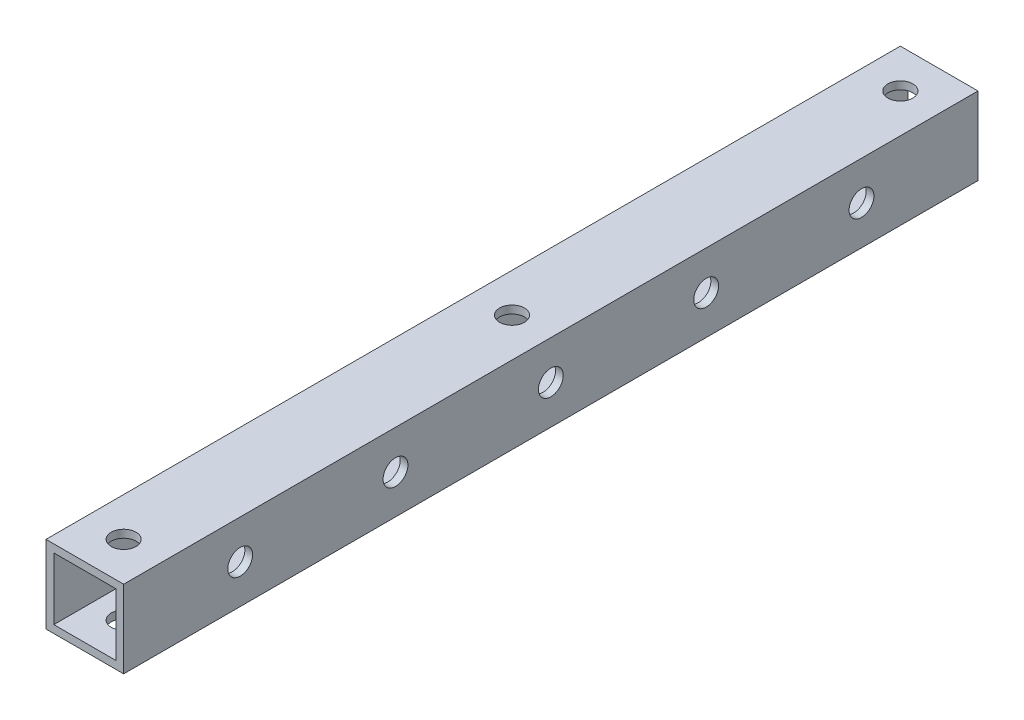
ISO-10303-21;
HEADER;
FILE_DESCRIPTION(('STEP AP214'),'2;1');
FILE_NAME('part.step','',(''),(''),'','','');
FILE_SCHEMA(('AUTOMOTIVE_DESIGN { 1 0 10303 214 1 1 1 1 }'));
ENDSEC;
DATA;
#1=APPLICATION_CONTEXT('core data for automotive mechanical design processes');
#2=APPLICATION_PROTOCOL_DEFINITION('international standard','automotive_design',2000,#1);
#3=PRODUCT_CONTEXT('',#1,'mechanical');
#4=PRODUCT('Part','Part','',(#3));
#5=PRODUCT_RELATED_PRODUCT_CATEGORY('part','',(#4));
#6=PRODUCT_DEFINITION_FORMATION('','',#4);
#7=PRODUCT_DEFINITION_CONTEXT('part definition',#1,'design');
#8=PRODUCT_DEFINITION('design','',#6,#7);
#9=PRODUCT_DEFINITION_SHAPE('','',#8);
#10=(LENGTH_UNIT() NAMED_UNIT(*) SI_UNIT(.MILLI.,.METRE.));
#11=(NAMED_UNIT(*) PLANE_ANGLE_UNIT() SI_UNIT($,.RADIAN.));
#12=(NAMED_UNIT(*) SI_UNIT($,.STERADIAN.) SOLID_ANGLE_UNIT());
#13=UNCERTAINTY_MEASURE_WITH_UNIT(LENGTH_MEASURE(1.E-05),#10,'distance_accuracy_value','');
#14=(GEOMETRIC_REPRESENTATION_CONTEXT(3) GLOBAL_UNCERTAINTY_ASSIGNED_CONTEXT((#13)) GLOBAL_UNIT_ASSIGNED_CONTEXT((#10,
#11,#12)) REPRESENTATION_CONTEXT('',''));
#15=CARTESIAN_POINT('',(0.,0.,0.));
#16=DIRECTION('',(0.,0.,1.));
#17=DIRECTION('',(1.,0.,0.));
#18=AXIS2_PLACEMENT_3D('',#15,#16,#17);
#19=CARTESIAN_POINT('',(-31.5217391304348,15.2173913043478,55.));
#20=DIRECTION('',(1.,0.,0.));
#21=DIRECTION('',(0.,0.,-1.));
#22=AXIS2_PLACEMENT_3D('',#19,#20,#21);
#23=PLANE('',#22);
#24=CARTESIAN_POINT('',(-31.5217391304348,10.2173913043478,35.));
#25=DIRECTION('',(1.,0.,0.));
#26=DIRECTION('',(0.,0.,-1.));
#27=AXIS2_PLACEMENT_3D('',#24,#25,#26);
#28=CIRCLE('',#27,1.6);
#29=CARTESIAN_POINT('',(-31.5217391304348,10.2173913043478,33.4));
#30=VERTEX_POINT('',#29);
#31=EDGE_CURVE('E179',#30,#30,#28,.T.);
#32=ORIENTED_EDGE('',*,*,#31,.T.);
#33=EDGE_LOOP('',(#32));
#34=FACE_BOUND('',#33,.T.);
#35=CARTESIAN_POINT('',(-31.5217391304348,10.2173913043478,15.));
#36=DIRECTION('',(1.,0.,0.));
#37=DIRECTION('',(0.,0.,-1.));
#38=AXIS2_PLACEMENT_3D('',#35,#36,#37);
#39=CIRCLE('',#38,1.6);
#40=CARTESIAN_POINT('',(-31.5217391304348,10.2173913043478,13.4));
#41=VERTEX_POINT('',#40);
#42=EDGE_CURVE('E172',#41,#41,#39,.T.);
#43=ORIENTED_EDGE('',*,*,#42,.T.);
#44=EDGE_LOOP('',(#43));
#45=FACE_BOUND('',#44,.T.);
#46=DIRECTION('',(0.,0.,-1.));
#47=VECTOR('',#46,1.);
#48=CARTESIAN_POINT('',(-31.5217391304348,5.21739130434782,55.));
#49=LINE('',#48,#47);
#50=CARTESIAN_POINT('',(-31.5217391304348,5.21739130434782,110.));
#51=VERTEX_POINT('',#50);
#52=CARTESIAN_POINT('',(-31.5217391304348,5.21739130434782,0.));
#53=VERTEX_POINT('',#52);
#54=EDGE_CURVE('E221',#51,#53,#49,.T.);
#55=ORIENTED_EDGE('',*,*,#54,.F.);
#56=DIRECTION('',(0.,-1.,0.));
#57=VECTOR('',#56,1.);
#58=CARTESIAN_POINT('',(-31.5217391304348,15.2173913043478,110.));
#59=LINE('',#58,#57);
#60=CARTESIAN_POINT('',(-31.5217391304348,15.2173913043478,110.));
#61=VERTEX_POINT('',#60);
#62=EDGE_CURVE('E131',#61,#51,#59,.T.);
#63=ORIENTED_EDGE('',*,*,#62,.F.);
#64=DIRECTION('',(0.,0.,-1.));
#65=VECTOR('',#64,1.);
#66=CARTESIAN_POINT('',(-31.5217391304348,15.2173913043478,55.));
#67=LINE('',#66,#65);
#68=CARTESIAN_POINT('',(-31.5217391304348,15.2173913043478,0.));
#69=VERTEX_POINT('',#68);
#70=EDGE_CURVE('E212',#61,#69,#67,.T.);
#71=ORIENTED_EDGE('',*,*,#70,.T.);
#72=DIRECTION('',(0.,-1.,0.));
#73=VECTOR('',#72,1.);
#74=CARTESIAN_POINT('',(-31.5217391304348,15.2173913043478,0.));
#75=LINE('',#74,#73);
#76=EDGE_CURVE('E107',#69,#53,#75,.T.);
#77=ORIENTED_EDGE('',*,*,#76,.T.);
#78=EDGE_LOOP('',(#55,#63,#71,#77));
#79=FACE_BOUND('',#78,.T.);
#80=CARTESIAN_POINT('',(-31.5217391304348,10.2173913043478,55.));
#81=DIRECTION('',(1.,0.,0.));
#82=DIRECTION('',(0.,0.,-1.));
#83=AXIS2_PLACEMENT_3D('',#80,#81,#82);
#84=CIRCLE('',#83,1.6);
#85=CARTESIAN_POINT('',(-31.5217391304348,10.2173913043478,53.4));
#86=VERTEX_POINT('',#85);
#87=EDGE_CURVE('E185',#86,#86,#84,.T.);
#88=ORIENTED_EDGE('',*,*,#87,.T.);
#89=EDGE_LOOP('',(#88));
#90=FACE_BOUND('',#89,.T.);
#91=CARTESIAN_POINT('',(-31.5217391304348,10.2173913043478,75.));
#92=DIRECTION('',(-1.,0.,0.));
#93=DIRECTION('',(0.,0.,1.));
#94=AXIS2_PLACEMENT_3D('',#91,#92,#93);
#95=CIRCLE('',#94,1.6);
#96=CARTESIAN_POINT('',(-31.5217391304348,10.2173913043478,76.6));
#97=VERTEX_POINT('',#96);
#98=EDGE_CURVE('E311',#97,#97,#95,.T.);
#99=ORIENTED_EDGE('',*,*,#98,.F.);
#100=EDGE_LOOP('',(#99));
#101=FACE_BOUND('',#100,.T.);
#102=CARTESIAN_POINT('',(-31.5217391304348,10.2173913043478,95.));
#103=DIRECTION('',(-1.,0.,0.));
#104=DIRECTION('',(0.,0.,1.));
#105=AXIS2_PLACEMENT_3D('',#102,#103,#104);
#106=CIRCLE('',#105,1.6);
#107=CARTESIAN_POINT('',(-31.5217391304348,10.2173913043478,96.6));
#108=VERTEX_POINT('',#107);
#109=EDGE_CURVE('E124',#108,#108,#106,.T.);
#110=ORIENTED_EDGE('',*,*,#109,.F.);
#111=EDGE_LOOP('',(#110));
#112=FACE_BOUND('',#111,.T.);
#113=ADVANCED_FACE('F33',(#34,#45,#79,#90,#101,#112),#23,.F.);
#114=CARTESIAN_POINT('',(0.,0.,110.));
#115=DIRECTION('',(0.,0.,-1.));
#116=DIRECTION('',(1.,0.,0.));
#117=AXIS2_PLACEMENT_3D('',#114,#115,#116);
#118=PLANE('',#117);
#119=ORIENTED_EDGE('',*,*,#62,.T.);
#120=DIRECTION('',(1.,0.,0.));
#121=VECTOR('',#120,1.);
#122=CARTESIAN_POINT('',(-31.5217391304348,5.21739130434782,110.));
#123=LINE('',#122,#121);
#124=CARTESIAN_POINT('',(-21.5217391304348,5.21739130434782,110.));
#125=VERTEX_POINT('',#124);
#126=EDGE_CURVE('E149',#51,#125,#123,.T.);
#127=ORIENTED_EDGE('',*,*,#126,.T.);
#128=DIRECTION('',(0.,1.,0.));
#129=VECTOR('',#128,1.);
#130=CARTESIAN_POINT('',(-21.5217391304348,15.2173913043478,110.));
#131=LINE('',#130,#129);
#132=CARTESIAN_POINT('',(-21.5217391304348,15.2173913043478,110.));
#133=VERTEX_POINT('',#132);
#134=EDGE_CURVE('E146',#125,#133,#131,.T.);
#135=ORIENTED_EDGE('',*,*,#134,.T.);
#136=DIRECTION('',(-1.,0.,0.));
#137=VECTOR('',#136,1.);
#138=CARTESIAN_POINT('',(-31.5217391304348,15.2173913043478,110.));
#139=LINE('',#138,#137);
#140=EDGE_CURVE('E143',#133,#61,#139,.T.);
#141=ORIENTED_EDGE('',*,*,#140,.T.);
#142=EDGE_LOOP('',(#119,#127,#135,#141));
#143=FACE_BOUND('',#142,.T.);
#144=DIRECTION('',(0.,-1.,0.));
#145=VECTOR('',#144,1.);
#146=CARTESIAN_POINT('',(-30.517415057778,0.,110.));
#147=LINE('',#146,#145);
#148=CARTESIAN_POINT('',(-30.5174150577781,14.2130672316911,110.));
#149=VERTEX_POINT('',#148);
#150=CARTESIAN_POINT('',(-30.517415057778,6.2130672316911,110.));
#151=VERTEX_POINT('',#150);
#152=EDGE_CURVE('E11',#149,#151,#147,.T.);
#153=ORIENTED_EDGE('',*,*,#152,.F.);
#154=DIRECTION('',(-1.,0.,0.));
#155=VECTOR('',#154,1.);
#156=CARTESIAN_POINT('',(0.,14.2130672316911,110.));
#157=LINE('',#156,#155);
#158=CARTESIAN_POINT('',(-22.517415057778,14.2130672316911,110.));
#159=VERTEX_POINT('',#158);
#160=EDGE_CURVE('E110',#159,#149,#157,.T.);
#161=ORIENTED_EDGE('',*,*,#160,.F.);
#162=DIRECTION('',(0.,1.,0.));
#163=VECTOR('',#162,1.);
#164=CARTESIAN_POINT('',(-22.517415057778,0.,110.));
#165=LINE('',#164,#163);
#166=CARTESIAN_POINT('',(-22.517415057778,6.2130672316911,110.));
#167=VERTEX_POINT('',#166);
#168=EDGE_CURVE('E114',#167,#159,#165,.T.);
#169=ORIENTED_EDGE('',*,*,#168,.F.);
#170=DIRECTION('',(1.,0.,0.));
#171=VECTOR('',#170,1.);
#172=CARTESIAN_POINT('',(0.,6.2130672316911,110.));
#173=LINE('',#172,#171);
#174=EDGE_CURVE('E41',#151,#167,#173,.T.);
#175=ORIENTED_EDGE('',*,*,#174,.F.);
#176=EDGE_LOOP('',(#153,#161,#169,#175));
#177=FACE_BOUND('',#176,.T.);
#178=ADVANCED_FACE('F117',(#143,#177),#118,.F.);
#179=CARTESIAN_POINT('',(-31.5217391304348,5.21739130434782,55.));
#180=DIRECTION('',(0.,1.,0.));
#181=DIRECTION('',(0.,0.,1.));
#182=AXIS2_PLACEMENT_3D('',#179,#180,#181);
#183=PLANE('',#182);
#184=CARTESIAN_POINT('',(-26.5217391304348,5.21739130434782,55.));
#185=DIRECTION('',(0.,1.,0.));
#186=DIRECTION('',(0.,0.,1.));
#187=AXIS2_PLACEMENT_3D('',#184,#185,#186);
#188=CIRCLE('',#187,1.6);
#189=CARTESIAN_POINT('',(-26.5217391304348,5.21739130434782,56.6));
#190=VERTEX_POINT('',#189);
#191=EDGE_CURVE('E153',#190,#190,#188,.T.);
#192=ORIENTED_EDGE('',*,*,#191,.T.);
#193=EDGE_LOOP('',(#192));
#194=FACE_BOUND('',#193,.T.);
#195=CARTESIAN_POINT('',(-26.5217391304348,5.21739130434782,105.));
#196=DIRECTION('',(0.,-1.,0.));
#197=DIRECTION('',(0.,0.,-1.));
#198=AXIS2_PLACEMENT_3D('',#195,#196,#197);
#199=CIRCLE('',#198,1.6);
#200=CARTESIAN_POINT('',(-26.5217391304348,5.21739130434782,103.4));
#201=VERTEX_POINT('',#200);
#202=EDGE_CURVE('E264',#201,#201,#199,.T.);
#203=ORIENTED_EDGE('',*,*,#202,.F.);
#204=EDGE_LOOP('',(#203));
#205=FACE_BOUND('',#204,.T.);
#206=DIRECTION('',(0.,0.,-1.));
#207=VECTOR('',#206,1.);
#208=CARTESIAN_POINT('',(-21.5217391304348,5.21739130434782,55.));
#209=LINE('',#208,#207);
#210=CARTESIAN_POINT('',(-21.5217391304348,5.21739130434782,0.));
#211=VERTEX_POINT('',#210);
#212=EDGE_CURVE('E218',#125,#211,#209,.T.);
#213=ORIENTED_EDGE('',*,*,#212,.F.);
#214=ORIENTED_EDGE('',*,*,#126,.F.);
#215=ORIENTED_EDGE('',*,*,#54,.T.);
#216=DIRECTION('',(1.,0.,0.));
#217=VECTOR('',#216,1.);
#218=CARTESIAN_POINT('',(-31.5217391304348,5.21739130434782,0.));
#219=LINE('',#218,#217);
#220=EDGE_CURVE('E206',#53,#211,#219,.T.);
#221=ORIENTED_EDGE('',*,*,#220,.T.);
#222=EDGE_LOOP('',(#213,#214,#215,#221));
#223=FACE_BOUND('',#222,.T.);
#224=CARTESIAN_POINT('',(-26.5217391304348,5.21739130434782,5.));
#225=DIRECTION('',(0.,1.,0.));
#226=DIRECTION('',(0.,0.,1.));
#227=AXIS2_PLACEMENT_3D('',#224,#225,#226);
#228=CIRCLE('',#227,1.6);
#229=CARTESIAN_POINT('',(-26.5217391304348,5.21739130434782,6.6));
#230=VERTEX_POINT('',#229);
#231=EDGE_CURVE('E152',#230,#230,#228,.T.);
#232=ORIENTED_EDGE('',*,*,#231,.T.);
#233=EDGE_LOOP('',(#232));
#234=FACE_BOUND('',#233,.T.);
#235=ADVANCED_FACE('F257',(#194,#205,#223,#234),#183,.F.);
#236=CARTESIAN_POINT('',(-21.5217391304348,15.2173913043478,55.));
#237=DIRECTION('',(-1.,0.,0.));
#238=DIRECTION('',(0.,0.,1.));
#239=AXIS2_PLACEMENT_3D('',#236,#237,#238);
#240=PLANE('',#239);
#241=CARTESIAN_POINT('',(-21.5217391304348,10.2173913043478,95.));
#242=DIRECTION('',(-1.,0.,0.));
#243=DIRECTION('',(0.,0.,1.));
#244=AXIS2_PLACEMENT_3D('',#241,#242,#243);
#245=CIRCLE('',#244,1.6);
#246=CARTESIAN_POINT('',(-21.5217391304348,10.2173913043478,96.6));
#247=VERTEX_POINT('',#246);
#248=EDGE_CURVE('E315',#247,#247,#245,.T.);
#249=ORIENTED_EDGE('',*,*,#248,.T.);
#250=EDGE_LOOP('',(#249));
#251=FACE_BOUND('',#250,.T.);
#252=CARTESIAN_POINT('',(-21.5217391304348,10.2173913043478,75.));
#253=DIRECTION('',(-1.,0.,0.));
#254=DIRECTION('',(0.,0.,1.));
#255=AXIS2_PLACEMENT_3D('',#252,#253,#254);
#256=CIRCLE('',#255,1.6);
#257=CARTESIAN_POINT('',(-21.5217391304348,10.2173913043478,76.6));
#258=VERTEX_POINT('',#257);
#259=EDGE_CURVE('E138',#258,#258,#256,.T.);
#260=ORIENTED_EDGE('',*,*,#259,.T.);
#261=EDGE_LOOP('',(#260));
#262=FACE_BOUND('',#261,.T.);
#263=CARTESIAN_POINT('',(-21.5217391304348,10.2173913043478,55.));
#264=DIRECTION('',(1.,0.,0.));
#265=DIRECTION('',(0.,0.,-1.));
#266=AXIS2_PLACEMENT_3D('',#263,#264,#265);
#267=CIRCLE('',#266,1.6);
#268=CARTESIAN_POINT('',(-21.5217391304348,10.2173913043478,53.4));
#269=VERTEX_POINT('',#268);
#270=EDGE_CURVE('E171',#269,#269,#267,.T.);
#271=ORIENTED_EDGE('',*,*,#270,.F.);
#272=EDGE_LOOP('',(#271));
#273=FACE_BOUND('',#272,.T.);
#274=DIRECTION('',(0.,0.,-1.));
#275=VECTOR('',#274,1.);
#276=CARTESIAN_POINT('',(-21.5217391304348,15.2173913043478,55.));
#277=LINE('',#276,#275);
#278=CARTESIAN_POINT('',(-21.5217391304348,15.2173913043478,0.));
#279=VERTEX_POINT('',#278);
#280=EDGE_CURVE('E215',#133,#279,#277,.T.);
#281=ORIENTED_EDGE('',*,*,#280,.F.);
#282=ORIENTED_EDGE('',*,*,#134,.F.);
#283=ORIENTED_EDGE('',*,*,#212,.T.);
#284=DIRECTION('',(0.,1.,0.));
#285=VECTOR('',#284,1.);
#286=CARTESIAN_POINT('',(-21.5217391304348,15.2173913043478,0.));
#287=LINE('',#286,#285);
#288=EDGE_CURVE('E208',#211,#279,#287,.T.);
#289=ORIENTED_EDGE('',*,*,#288,.T.);
#290=EDGE_LOOP('',(#281,#282,#283,#289));
#291=FACE_BOUND('',#290,.T.);
#292=CARTESIAN_POINT('',(-21.5217391304348,10.2173913043478,15.));
#293=DIRECTION('',(1.,0.,0.));
#294=DIRECTION('',(0.,0.,-1.));
#295=AXIS2_PLACEMENT_3D('',#292,#293,#294);
#296=CIRCLE('',#295,1.6);
#297=CARTESIAN_POINT('',(-21.5217391304348,10.2173913043478,13.4));
#298=VERTEX_POINT('',#297);
#299=EDGE_CURVE('E176',#298,#298,#296,.T.);
#300=ORIENTED_EDGE('',*,*,#299,.F.);
#301=EDGE_LOOP('',(#300));
#302=FACE_BOUND('',#301,.T.);
#303=CARTESIAN_POINT('',(-21.5217391304348,10.2173913043478,35.));
#304=DIRECTION('',(1.,0.,0.));
#305=DIRECTION('',(0.,0.,-1.));
#306=AXIS2_PLACEMENT_3D('',#303,#304,#305);
#307=CIRCLE('',#306,1.6);
#308=CARTESIAN_POINT('',(-21.5217391304348,10.2173913043478,33.4));
#309=VERTEX_POINT('',#308);
#310=EDGE_CURVE('E182',#309,#309,#307,.T.);
#311=ORIENTED_EDGE('',*,*,#310,.F.);
#312=EDGE_LOOP('',(#311));
#313=FACE_BOUND('',#312,.T.);
#314=ADVANCED_FACE('F260',(#251,#262,#273,#291,#302,#313),#240,.F.);
#315=CARTESIAN_POINT('',(-31.5217391304348,15.2173913043478,55.));
#316=DIRECTION('',(0.,-1.,0.));
#317=DIRECTION('',(0.,0.,-1.));
#318=AXIS2_PLACEMENT_3D('',#315,#316,#317);
#319=PLANE('',#318);
#320=CARTESIAN_POINT('',(-26.5217391304348,15.2173913043478,55.));
#321=DIRECTION('',(0.,1.,0.));
#322=DIRECTION('',(0.,0.,1.));
#323=AXIS2_PLACEMENT_3D('',#320,#321,#322);
#324=CIRCLE('',#323,1.6);
#325=CARTESIAN_POINT('',(-26.5217391304348,15.2173913043478,56.6));
#326=VERTEX_POINT('',#325);
#327=EDGE_CURVE('E157',#326,#326,#324,.T.);
#328=ORIENTED_EDGE('',*,*,#327,.F.);
#329=EDGE_LOOP('',(#328));
#330=FACE_BOUND('',#329,.T.);
#331=CARTESIAN_POINT('',(-26.5217391304348,15.2173913043478,105.));
#332=DIRECTION('',(0.,-1.,0.));
#333=DIRECTION('',(0.,0.,-1.));
#334=AXIS2_PLACEMENT_3D('',#331,#332,#333);
#335=CIRCLE('',#334,1.6);
#336=CARTESIAN_POINT('',(-26.5217391304348,15.2173913043478,103.4));
#337=VERTEX_POINT('',#336);
#338=EDGE_CURVE('E332',#337,#337,#335,.T.);
#339=ORIENTED_EDGE('',*,*,#338,.T.);
#340=EDGE_LOOP('',(#339));
#341=FACE_BOUND('',#340,.T.);
#342=CARTESIAN_POINT('',(-26.5217391304348,15.2173913043478,5.));
#343=DIRECTION('',(0.,1.,0.));
#344=DIRECTION('',(0.,0.,1.));
#345=AXIS2_PLACEMENT_3D('',#342,#343,#344);
#346=CIRCLE('',#345,1.6);
#347=CARTESIAN_POINT('',(-26.5217391304348,15.2173913043478,6.6));
#348=VERTEX_POINT('',#347);
#349=EDGE_CURVE('E160',#348,#348,#346,.T.);
#350=ORIENTED_EDGE('',*,*,#349,.F.);
#351=EDGE_LOOP('',(#350));
#352=FACE_BOUND('',#351,.T.);
#353=ORIENTED_EDGE('',*,*,#70,.F.);
#354=ORIENTED_EDGE('',*,*,#140,.F.);
#355=ORIENTED_EDGE('',*,*,#280,.T.);
#356=DIRECTION('',(-1.,0.,0.));
#357=VECTOR('',#356,1.);
#358=CARTESIAN_POINT('',(-31.5217391304348,15.2173913043478,0.));
#359=LINE('',#358,#357);
#360=EDGE_CURVE('E210',#279,#69,#359,.T.);
#361=ORIENTED_EDGE('',*,*,#360,.T.);
#362=EDGE_LOOP('',(#353,#354,#355,#361));
#363=FACE_BOUND('',#362,.T.);
#364=ADVANCED_FACE('F338',(#330,#341,#352,#363),#319,.F.);
#365=CARTESIAN_POINT('',(0.,0.,0.));
#366=DIRECTION('',(0.,0.,1.));
#367=DIRECTION('',(1.,0.,0.));
#368=AXIS2_PLACEMENT_3D('',#365,#366,#367);
#369=PLANE('',#368);
#370=DIRECTION('',(-1.,0.,0.));
#371=VECTOR('',#370,1.);
#372=CARTESIAN_POINT('',(0.,14.2130672316911,0.));
#373=LINE('',#372,#371);
#374=CARTESIAN_POINT('',(-22.517415057778,14.2130672316911,0.));
#375=VERTEX_POINT('',#374);
#376=CARTESIAN_POINT('',(-30.5174150577781,14.2130672316911,0.));
#377=VERTEX_POINT('',#376);
#378=EDGE_CURVE('E230',#375,#377,#373,.T.);
#379=ORIENTED_EDGE('',*,*,#378,.T.);
#380=DIRECTION('',(0.,-1.,0.));
#381=VECTOR('',#380,1.);
#382=CARTESIAN_POINT('',(-30.517415057778,0.,0.));
#383=LINE('',#382,#381);
#384=CARTESIAN_POINT('',(-30.517415057778,6.2130672316911,0.));
#385=VERTEX_POINT('',#384);
#386=EDGE_CURVE('E105',#377,#385,#383,.T.);
#387=ORIENTED_EDGE('',*,*,#386,.T.);
#388=DIRECTION('',(1.,0.,0.));
#389=VECTOR('',#388,1.);
#390=CARTESIAN_POINT('',(0.,6.2130672316911,0.));
#391=LINE('',#390,#389);
#392=CARTESIAN_POINT('',(-22.517415057778,6.2130672316911,0.));
#393=VERTEX_POINT('',#392);
#394=EDGE_CURVE('E224',#385,#393,#391,.T.);
#395=ORIENTED_EDGE('',*,*,#394,.T.);
#396=DIRECTION('',(0.,1.,0.));
#397=VECTOR('',#396,1.);
#398=CARTESIAN_POINT('',(-22.517415057778,0.,0.));
#399=LINE('',#398,#397);
#400=EDGE_CURVE('E227',#393,#375,#399,.T.);
#401=ORIENTED_EDGE('',*,*,#400,.T.);
#402=EDGE_LOOP('',(#379,#387,#395,#401));
#403=FACE_BOUND('',#402,.T.);
#404=ORIENTED_EDGE('',*,*,#76,.F.);
#405=ORIENTED_EDGE('',*,*,#360,.F.);
#406=ORIENTED_EDGE('',*,*,#288,.F.);
#407=ORIENTED_EDGE('',*,*,#220,.F.);
#408=EDGE_LOOP('',(#404,#405,#406,#407));
#409=FACE_BOUND('',#408,.T.);
#410=ADVANCED_FACE('F281',(#403,#409),#369,.F.);
#411=CARTESIAN_POINT('',(-30.5174150577781,14.2130672316911,-55.));
#412=DIRECTION('',(-1.,0.,0.));
#413=DIRECTION('',(0.,-1.,0.));
#414=AXIS2_PLACEMENT_3D('',#411,#412,#413);
#415=PLANE('',#414);
#416=CARTESIAN_POINT('',(-30.5174150577781,10.2173913043478,95.));
#417=DIRECTION('',(-1.,0.,0.));
#418=DIRECTION('',(0.,-1.,0.));
#419=AXIS2_PLACEMENT_3D('',#416,#417,#418);
#420=CIRCLE('',#419,1.6);
#421=CARTESIAN_POINT('',(-30.5174150577781,8.61739130434782,95.));
#422=VERTEX_POINT('',#421);
#423=EDGE_CURVE('E127',#422,#422,#420,.F.);
#424=ORIENTED_EDGE('',*,*,#423,.F.);
#425=EDGE_LOOP('',(#424));
#426=FACE_BOUND('',#425,.T.);
#427=CARTESIAN_POINT('',(-30.5174150577781,10.2173913043478,75.));
#428=DIRECTION('',(-1.,0.,0.));
#429=DIRECTION('',(0.,-1.,0.));
#430=AXIS2_PLACEMENT_3D('',#427,#428,#429);
#431=CIRCLE('',#430,1.6);
#432=CARTESIAN_POINT('',(-30.5174150577781,8.61739130434782,75.));
#433=VERTEX_POINT('',#432);
#434=EDGE_CURVE('E123',#433,#433,#431,.F.);
#435=ORIENTED_EDGE('',*,*,#434,.F.);
#436=EDGE_LOOP('',(#435));
#437=FACE_BOUND('',#436,.T.);
#438=CARTESIAN_POINT('',(-30.5174150577781,10.2173913043478,55.));
#439=DIRECTION('',(-1.,0.,0.));
#440=DIRECTION('',(0.,-1.,0.));
#441=AXIS2_PLACEMENT_3D('',#438,#439,#440);
#442=CIRCLE('',#441,1.6);
#443=CARTESIAN_POINT('',(-30.5174150577781,8.61739130434782,55.));
#444=VERTEX_POINT('',#443);
#445=EDGE_CURVE('E175',#444,#444,#442,.T.);
#446=ORIENTED_EDGE('',*,*,#445,.T.);
#447=EDGE_LOOP('',(#446));
#448=FACE_BOUND('',#447,.T.);
#449=CARTESIAN_POINT('',(-30.5174150577781,10.2173913043478,15.));
#450=DIRECTION('',(-1.,0.,0.));
#451=DIRECTION('',(0.,-1.,0.));
#452=AXIS2_PLACEMENT_3D('',#449,#450,#451);
#453=CIRCLE('',#452,1.6);
#454=CARTESIAN_POINT('',(-30.5174150577781,8.61739130434782,15.));
#455=VERTEX_POINT('',#454);
#456=EDGE_CURVE('E197',#455,#455,#453,.T.);
#457=ORIENTED_EDGE('',*,*,#456,.T.);
#458=EDGE_LOOP('',(#457));
#459=FACE_BOUND('',#458,.T.);
#460=CARTESIAN_POINT('',(-30.5174150577781,10.2173913043478,35.));
#461=DIRECTION('',(-1.,0.,0.));
#462=DIRECTION('',(0.,-1.,0.));
#463=AXIS2_PLACEMENT_3D('',#460,#461,#462);
#464=CIRCLE('',#463,1.6);
#465=CARTESIAN_POINT('',(-30.5174150577781,8.61739130434782,35.));
#466=VERTEX_POINT('',#465);
#467=EDGE_CURVE('E193',#466,#466,#464,.T.);
#468=ORIENTED_EDGE('',*,*,#467,.T.);
#469=EDGE_LOOP('',(#468));
#470=FACE_BOUND('',#469,.T.);
#471=DIRECTION('',(0.,0.,1.));
#472=VECTOR('',#471,1.);
#473=CARTESIAN_POINT('',(-30.5174150577781,14.2130672316911,-55.));
#474=LINE('',#473,#472);
#475=EDGE_CURVE('E99',#377,#149,#474,.T.);
#476=ORIENTED_EDGE('',*,*,#475,.T.);
#477=ORIENTED_EDGE('',*,*,#152,.T.);
#478=DIRECTION('',(0.,0.,1.));
#479=VECTOR('',#478,1.);
#480=CARTESIAN_POINT('',(-30.517415057778,6.2130672316911,-55.));
#481=LINE('',#480,#479);
#482=EDGE_CURVE('E199',#385,#151,#481,.T.);
#483=ORIENTED_EDGE('',*,*,#482,.F.);
#484=ORIENTED_EDGE('',*,*,#386,.F.);
#485=EDGE_LOOP('',(#476,#477,#483,#484));
#486=FACE_BOUND('',#485,.T.);
#487=ADVANCED_FACE('F100',(#426,#437,#448,#459,#470,#486),#415,.F.);
#488=CARTESIAN_POINT('',(-30.5174150577781,14.2130672316911,-55.));
#489=DIRECTION('',(0.,1.,0.));
#490=DIRECTION('',(0.,0.,1.));
#491=AXIS2_PLACEMENT_3D('',#488,#489,#490);
#492=PLANE('',#491);
#493=CARTESIAN_POINT('',(-26.5217391304348,14.2130672316911,55.));
#494=DIRECTION('',(0.,1.,0.));
#495=DIRECTION('',(0.,0.,1.));
#496=AXIS2_PLACEMENT_3D('',#493,#494,#495);
#497=CIRCLE('',#496,1.6);
#498=CARTESIAN_POINT('',(-26.5217391304348,14.2130672316911,56.6));
#499=VERTEX_POINT('',#498);
#500=EDGE_CURVE('E168',#499,#499,#497,.T.);
#501=ORIENTED_EDGE('',*,*,#500,.T.);
#502=EDGE_LOOP('',(#501));
#503=FACE_BOUND('',#502,.T.);
#504=CARTESIAN_POINT('',(-26.5217391304348,14.2130672316911,105.));
#505=DIRECTION('',(0.,1.,0.));
#506=DIRECTION('',(0.,0.,1.));
#507=AXIS2_PLACEMENT_3D('',#504,#505,#506);
#508=CIRCLE('',#507,1.6);
#509=CARTESIAN_POINT('',(-26.5217391304348,14.2130672316911,106.6));
#510=VERTEX_POINT('',#509);
#511=EDGE_CURVE('E320',#510,#510,#508,.F.);
#512=ORIENTED_EDGE('',*,*,#511,.F.);
#513=EDGE_LOOP('',(#512));
#514=FACE_BOUND('',#513,.T.);
#515=CARTESIAN_POINT('',(-26.5217391304348,14.2130672316911,5.));
#516=DIRECTION('',(0.,1.,0.));
#517=DIRECTION('',(0.,0.,1.));
#518=AXIS2_PLACEMENT_3D('',#515,#516,#517);
#519=CIRCLE('',#518,1.6);
#520=CARTESIAN_POINT('',(-26.5217391304348,14.2130672316911,6.6));
#521=VERTEX_POINT('',#520);
#522=EDGE_CURVE('E165',#521,#521,#519,.T.);
#523=ORIENTED_EDGE('',*,*,#522,.T.);
#524=EDGE_LOOP('',(#523));
#525=FACE_BOUND('',#524,.T.);
#526=DIRECTION('',(0.,0.,1.));
#527=VECTOR('',#526,1.);
#528=CARTESIAN_POINT('',(-22.517415057778,14.2130672316911,-55.));
#529=LINE('',#528,#527);
#530=EDGE_CURVE('E49',#375,#159,#529,.T.);
#531=ORIENTED_EDGE('',*,*,#530,.T.);
#532=ORIENTED_EDGE('',*,*,#160,.T.);
#533=ORIENTED_EDGE('',*,*,#475,.F.);
#534=ORIENTED_EDGE('',*,*,#378,.F.);
#535=EDGE_LOOP('',(#531,#532,#533,#534));
#536=FACE_BOUND('',#535,.T.);
#537=ADVANCED_FACE('F111',(#503,#514,#525,#536),#492,.F.);
#538=CARTESIAN_POINT('',(-22.517415057778,14.2130672316911,-55.));
#539=DIRECTION('',(1.,0.,0.));
#540=DIRECTION('',(0.,1.,0.));
#541=AXIS2_PLACEMENT_3D('',#538,#539,#540);
#542=PLANE('',#541);
#543=CARTESIAN_POINT('',(-22.517415057778,10.2173913043478,95.));
#544=DIRECTION('',(1.,0.,0.));
#545=DIRECTION('',(0.,1.,0.));
#546=AXIS2_PLACEMENT_3D('',#543,#544,#545);
#547=CIRCLE('',#546,1.6);
#548=CARTESIAN_POINT('',(-22.517415057778,11.8173913043478,95.));
#549=VERTEX_POINT('',#548);
#550=EDGE_CURVE('E125',#549,#549,#547,.F.);
#551=ORIENTED_EDGE('',*,*,#550,.F.);
#552=EDGE_LOOP('',(#551));
#553=FACE_BOUND('',#552,.T.);
#554=CARTESIAN_POINT('',(-22.517415057778,10.2173913043478,75.));
#555=DIRECTION('',(1.,0.,0.));
#556=DIRECTION('',(0.,1.,0.));
#557=AXIS2_PLACEMENT_3D('',#554,#555,#556);
#558=CIRCLE('',#557,1.6);
#559=CARTESIAN_POINT('',(-22.517415057778,11.8173913043478,75.));
#560=VERTEX_POINT('',#559);
#561=EDGE_CURVE('E121',#560,#560,#558,.F.);
#562=ORIENTED_EDGE('',*,*,#561,.F.);
#563=EDGE_LOOP('',(#562));
#564=FACE_BOUND('',#563,.T.);
#565=CARTESIAN_POINT('',(-22.517415057778,10.2173913043478,55.));
#566=DIRECTION('',(1.,0.,0.));
#567=DIRECTION('',(0.,1.,0.));
#568=AXIS2_PLACEMENT_3D('',#565,#566,#567);
#569=CIRCLE('',#568,1.6);
#570=CARTESIAN_POINT('',(-22.517415057778,11.8173913043478,55.));
#571=VERTEX_POINT('',#570);
#572=EDGE_CURVE('E233',#571,#571,#569,.T.);
#573=ORIENTED_EDGE('',*,*,#572,.T.);
#574=EDGE_LOOP('',(#573));
#575=FACE_BOUND('',#574,.T.);
#576=CARTESIAN_POINT('',(-22.517415057778,10.2173913043478,15.));
#577=DIRECTION('',(1.,0.,0.));
#578=DIRECTION('',(0.,1.,0.));
#579=AXIS2_PLACEMENT_3D('',#576,#577,#578);
#580=CIRCLE('',#579,1.6);
#581=CARTESIAN_POINT('',(-22.517415057778,11.8173913043478,15.));
#582=VERTEX_POINT('',#581);
#583=EDGE_CURVE('E196',#582,#582,#580,.T.);
#584=ORIENTED_EDGE('',*,*,#583,.T.);
#585=EDGE_LOOP('',(#584));
#586=FACE_BOUND('',#585,.T.);
#587=CARTESIAN_POINT('',(-22.517415057778,10.2173913043478,35.));
#588=DIRECTION('',(1.,0.,0.));
#589=DIRECTION('',(0.,1.,0.));
#590=AXIS2_PLACEMENT_3D('',#587,#588,#589);
#591=CIRCLE('',#590,1.6);
#592=CARTESIAN_POINT('',(-22.517415057778,11.8173913043478,35.));
#593=VERTEX_POINT('',#592);
#594=EDGE_CURVE('E192',#593,#593,#591,.T.);
#595=ORIENTED_EDGE('',*,*,#594,.T.);
#596=EDGE_LOOP('',(#595));
#597=FACE_BOUND('',#596,.T.);
#598=DIRECTION('',(0.,0.,1.));
#599=VECTOR('',#598,1.);
#600=CARTESIAN_POINT('',(-22.517415057778,6.2130672316911,-55.));
#601=LINE('',#600,#599);
#602=EDGE_CURVE('E57',#393,#167,#601,.T.);
#603=ORIENTED_EDGE('',*,*,#602,.T.);
#604=ORIENTED_EDGE('',*,*,#168,.T.);
#605=ORIENTED_EDGE('',*,*,#530,.F.);
#606=ORIENTED_EDGE('',*,*,#400,.F.);
#607=EDGE_LOOP('',(#603,#604,#605,#606));
#608=FACE_BOUND('',#607,.T.);
#609=ADVANCED_FACE('F278',(#553,#564,#575,#586,#597,#608),#542,.F.);
#610=CARTESIAN_POINT('',(-30.517415057778,6.2130672316911,-55.));
#611=DIRECTION('',(0.,-1.,0.));
#612=DIRECTION('',(0.,0.,-1.));
#613=AXIS2_PLACEMENT_3D('',#610,#611,#612);
#614=PLANE('',#613);
#615=CARTESIAN_POINT('',(-26.5217391304348,6.2130672316911,55.));
#616=DIRECTION('',(0.,-1.,0.));
#617=DIRECTION('',(0.,0.,-1.));
#618=AXIS2_PLACEMENT_3D('',#615,#616,#617);
#619=CIRCLE('',#618,1.6);
#620=CARTESIAN_POINT('',(-26.5217391304348,6.2130672316911,53.4));
#621=VERTEX_POINT('',#620);
#622=EDGE_CURVE('E115',#621,#621,#619,.T.);
#623=ORIENTED_EDGE('',*,*,#622,.T.);
#624=EDGE_LOOP('',(#623));
#625=FACE_BOUND('',#624,.T.);
#626=CARTESIAN_POINT('',(-26.5217391304348,6.2130672316911,105.));
#627=DIRECTION('',(0.,-1.,0.));
#628=DIRECTION('',(0.,0.,-1.));
#629=AXIS2_PLACEMENT_3D('',#626,#627,#628);
#630=CIRCLE('',#629,1.6);
#631=CARTESIAN_POINT('',(-26.5217391304348,6.2130672316911,103.4));
#632=VERTEX_POINT('',#631);
#633=EDGE_CURVE('E36',#632,#632,#630,.F.);
#634=ORIENTED_EDGE('',*,*,#633,.F.);
#635=EDGE_LOOP('',(#634));
#636=FACE_BOUND('',#635,.T.);
#637=CARTESIAN_POINT('',(-26.5217391304348,6.2130672316911,5.));
#638=DIRECTION('',(0.,-1.,0.));
#639=DIRECTION('',(0.,0.,-1.));
#640=AXIS2_PLACEMENT_3D('',#637,#638,#639);
#641=CIRCLE('',#640,1.6);
#642=CARTESIAN_POINT('',(-26.5217391304348,6.2130672316911,3.4));
#643=VERTEX_POINT('',#642);
#644=EDGE_CURVE('E156',#643,#643,#641,.T.);
#645=ORIENTED_EDGE('',*,*,#644,.T.);
#646=EDGE_LOOP('',(#645));
#647=FACE_BOUND('',#646,.T.);
#648=ORIENTED_EDGE('',*,*,#482,.T.);
#649=ORIENTED_EDGE('',*,*,#174,.T.);
#650=ORIENTED_EDGE('',*,*,#602,.F.);
#651=ORIENTED_EDGE('',*,*,#394,.F.);
#652=EDGE_LOOP('',(#648,#649,#650,#651));
#653=FACE_BOUND('',#652,.T.);
#654=ADVANCED_FACE('F245',(#625,#636,#647,#653),#614,.F.);
#655=CARTESIAN_POINT('',(-31.5217391304348,10.2173913043478,55.));
#656=DIRECTION('',(1.,0.,0.));
#657=DIRECTION('',(0.,0.,-1.));
#658=AXIS2_PLACEMENT_3D('',#655,#656,#657);
#659=CYLINDRICAL_SURFACE('',#658,1.6);
#660=ORIENTED_EDGE('',*,*,#572,.F.);
#661=EDGE_LOOP('',(#660));
#662=FACE_BOUND('',#661,.T.);
#663=ORIENTED_EDGE('',*,*,#270,.T.);
#664=EDGE_LOOP('',(#663));
#665=FACE_BOUND('',#664,.T.);
#666=ADVANCED_FACE('F277',(#662,#665),#659,.F.);
#667=CARTESIAN_POINT('',(-31.5217391304348,10.2173913043478,35.));
#668=DIRECTION('',(1.,0.,0.));
#669=DIRECTION('',(0.,0.,-1.));
#670=AXIS2_PLACEMENT_3D('',#667,#668,#669);
#671=CYLINDRICAL_SURFACE('',#670,1.6);
#672=ORIENTED_EDGE('',*,*,#310,.T.);
#673=EDGE_LOOP('',(#672));
#674=FACE_BOUND('',#673,.T.);
#675=ORIENTED_EDGE('',*,*,#594,.F.);
#676=EDGE_LOOP('',(#675));
#677=FACE_BOUND('',#676,.T.);
#678=ADVANCED_FACE('F370',(#674,#677),#671,.F.);
#679=CARTESIAN_POINT('',(-31.5217391304348,10.2173913043478,15.));
#680=DIRECTION('',(1.,0.,0.));
#681=DIRECTION('',(0.,0.,-1.));
#682=AXIS2_PLACEMENT_3D('',#679,#680,#681);
#683=CYLINDRICAL_SURFACE('',#682,1.6);
#684=ORIENTED_EDGE('',*,*,#299,.T.);
#685=EDGE_LOOP('',(#684));
#686=FACE_BOUND('',#685,.T.);
#687=ORIENTED_EDGE('',*,*,#583,.F.);
#688=EDGE_LOOP('',(#687));
#689=FACE_BOUND('',#688,.T.);
#690=ADVANCED_FACE('F365',(#686,#689),#683,.F.);
#691=ORIENTED_EDGE('',*,*,#87,.F.);
#692=EDGE_LOOP('',(#691));
#693=FACE_BOUND('',#692,.T.);
#694=ORIENTED_EDGE('',*,*,#445,.F.);
#695=EDGE_LOOP('',(#694));
#696=FACE_BOUND('',#695,.T.);
#697=ADVANCED_FACE('F368',(#693,#696),#659,.F.);
#698=ORIENTED_EDGE('',*,*,#31,.F.);
#699=EDGE_LOOP('',(#698));
#700=FACE_BOUND('',#699,.T.);
#701=ORIENTED_EDGE('',*,*,#467,.F.);
#702=EDGE_LOOP('',(#701));
#703=FACE_BOUND('',#702,.T.);
#704=ADVANCED_FACE('F363',(#700,#703),#671,.F.);
#705=ORIENTED_EDGE('',*,*,#42,.F.);
#706=EDGE_LOOP('',(#705));
#707=FACE_BOUND('',#706,.T.);
#708=ORIENTED_EDGE('',*,*,#456,.F.);
#709=EDGE_LOOP('',(#708));
#710=FACE_BOUND('',#709,.T.);
#711=ADVANCED_FACE('F272',(#707,#710),#683,.F.);
#712=CARTESIAN_POINT('',(-26.5217391304348,5.21739130434782,5.));
#713=DIRECTION('',(0.,1.,0.));
#714=DIRECTION('',(0.,0.,1.));
#715=AXIS2_PLACEMENT_3D('',#712,#713,#714);
#716=CYLINDRICAL_SURFACE('',#715,1.6);
#717=ORIENTED_EDGE('',*,*,#231,.F.);
#718=EDGE_LOOP('',(#717));
#719=FACE_BOUND('',#718,.T.);
#720=ORIENTED_EDGE('',*,*,#644,.F.);
#721=EDGE_LOOP('',(#720));
#722=FACE_BOUND('',#721,.T.);
#723=ADVANCED_FACE('F252',(#719,#722),#716,.F.);
#724=CARTESIAN_POINT('',(-26.5217391304348,5.21739130434782,55.));
#725=DIRECTION('',(0.,1.,0.));
#726=DIRECTION('',(0.,0.,1.));
#727=AXIS2_PLACEMENT_3D('',#724,#725,#726);
#728=CYLINDRICAL_SURFACE('',#727,1.6);
#729=ORIENTED_EDGE('',*,*,#622,.F.);
#730=EDGE_LOOP('',(#729));
#731=FACE_BOUND('',#730,.T.);
#732=ORIENTED_EDGE('',*,*,#191,.F.);
#733=EDGE_LOOP('',(#732));
#734=FACE_BOUND('',#733,.T.);
#735=ADVANCED_FACE('F248',(#731,#734),#728,.F.);
#736=ORIENTED_EDGE('',*,*,#349,.T.);
#737=EDGE_LOOP('',(#736));
#738=FACE_BOUND('',#737,.T.);
#739=ORIENTED_EDGE('',*,*,#522,.F.);
#740=EDGE_LOOP('',(#739));
#741=FACE_BOUND('',#740,.T.);
#742=ADVANCED_FACE('F251',(#738,#741),#716,.F.);
#743=ORIENTED_EDGE('',*,*,#327,.T.);
#744=EDGE_LOOP('',(#743));
#745=FACE_BOUND('',#744,.T.);
#746=ORIENTED_EDGE('',*,*,#500,.F.);
#747=EDGE_LOOP('',(#746));
#748=FACE_BOUND('',#747,.T.);
#749=ADVANCED_FACE('F254',(#745,#748),#728,.F.);
#750=CARTESIAN_POINT('',(-31.5217391304348,10.2173913043478,75.));
#751=DIRECTION('',(1.,0.,0.));
#752=DIRECTION('',(0.,0.,-1.));
#753=AXIS2_PLACEMENT_3D('',#750,#751,#752);
#754=CYLINDRICAL_SURFACE('',#753,1.6);
#755=ORIENTED_EDGE('',*,*,#259,.F.);
#756=EDGE_LOOP('',(#755));
#757=FACE_BOUND('',#756,.T.);
#758=ORIENTED_EDGE('',*,*,#561,.T.);
#759=EDGE_LOOP('',(#758));
#760=FACE_BOUND('',#759,.T.);
#761=ADVANCED_FACE('F355',(#757,#760),#754,.F.);
#762=CARTESIAN_POINT('',(-31.5217391304348,10.2173913043478,95.));
#763=DIRECTION('',(1.,0.,0.));
#764=DIRECTION('',(0.,0.,-1.));
#765=AXIS2_PLACEMENT_3D('',#762,#763,#764);
#766=CYLINDRICAL_SURFACE('',#765,1.6);
#767=ORIENTED_EDGE('',*,*,#248,.F.);
#768=EDGE_LOOP('',(#767));
#769=FACE_BOUND('',#768,.T.);
#770=ORIENTED_EDGE('',*,*,#550,.T.);
#771=EDGE_LOOP('',(#770));
#772=FACE_BOUND('',#771,.T.);
#773=ADVANCED_FACE('F353',(#769,#772),#766,.F.);
#774=ORIENTED_EDGE('',*,*,#98,.T.);
#775=EDGE_LOOP('',(#774));
#776=FACE_BOUND('',#775,.T.);
#777=ORIENTED_EDGE('',*,*,#434,.T.);
#778=EDGE_LOOP('',(#777));
#779=FACE_BOUND('',#778,.T.);
#780=ADVANCED_FACE('F352',(#776,#779),#754,.F.);
#781=ORIENTED_EDGE('',*,*,#109,.T.);
#782=EDGE_LOOP('',(#781));
#783=FACE_BOUND('',#782,.T.);
#784=ORIENTED_EDGE('',*,*,#423,.T.);
#785=EDGE_LOOP('',(#784));
#786=FACE_BOUND('',#785,.T.);
#787=ADVANCED_FACE('F348',(#783,#786),#766,.F.);
#788=CARTESIAN_POINT('',(-26.5217391304348,5.21739130434782,105.));
#789=DIRECTION('',(0.,1.,0.));
#790=DIRECTION('',(0.,0.,1.));
#791=AXIS2_PLACEMENT_3D('',#788,#789,#790);
#792=CYLINDRICAL_SURFACE('',#791,1.6);
#793=ORIENTED_EDGE('',*,*,#202,.T.);
#794=EDGE_LOOP('',(#793));
#795=FACE_BOUND('',#794,.T.);
#796=ORIENTED_EDGE('',*,*,#633,.T.);
#797=EDGE_LOOP('',(#796));
#798=FACE_BOUND('',#797,.T.);
#799=ADVANCED_FACE('F343',(#795,#798),#792,.F.);
#800=ORIENTED_EDGE('',*,*,#338,.F.);
#801=EDGE_LOOP('',(#800));
#802=FACE_BOUND('',#801,.T.);
#803=ORIENTED_EDGE('',*,*,#511,.T.);
#804=EDGE_LOOP('',(#803));
#805=FACE_BOUND('',#804,.T.);
#806=ADVANCED_FACE('F341',(#802,#805),#792,.F.);
#807=CLOSED_SHELL('',(#113,#178,#235,#314,#364,#410,#487,#537,#609,#654,#666,#678,#690,#697,
#704,#711,#723,#735,#742,#749,#761,#773,#780,#787,#799,#806));
#808=MANIFOLD_SOLID_BREP('B2',#807);
#809=ADVANCED_BREP_SHAPE_REPRESENTATION('',(#18,#808),#14);
#810=SHAPE_DEFINITION_REPRESENTATION(#9,#809);
ENDSEC;
END-ISO-10303-21;
